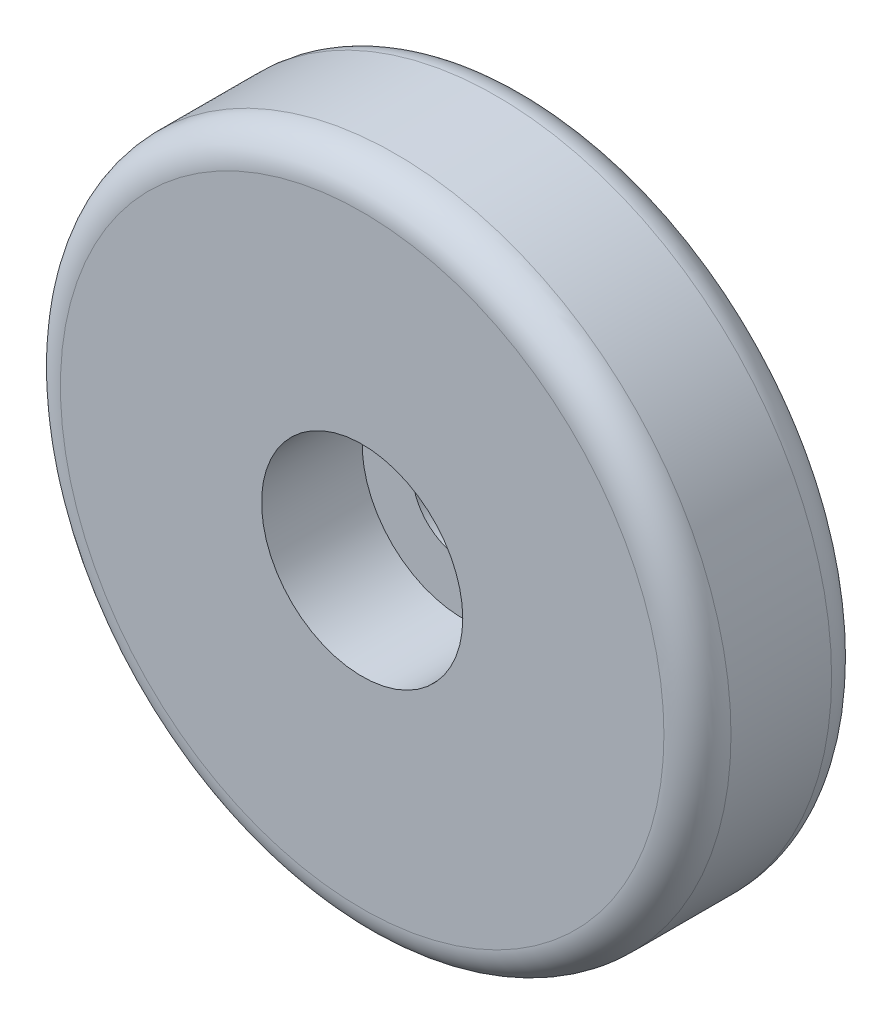
ISO-10303-21;
HEADER;
FILE_DESCRIPTION(('STEP AP214'),'2;1');
FILE_NAME('part.step','',(''),(''),'','','');
FILE_SCHEMA(('AUTOMOTIVE_DESIGN { 1 0 10303 214 1 1 1 1 }'));
ENDSEC;
DATA;
#1=APPLICATION_CONTEXT('core data for automotive mechanical design processes');
#2=APPLICATION_PROTOCOL_DEFINITION('international standard','automotive_design',2000,#1);
#3=PRODUCT_CONTEXT('',#1,'mechanical');
#4=PRODUCT('Part','Part','',(#3));
#5=PRODUCT_RELATED_PRODUCT_CATEGORY('part','',(#4));
#6=PRODUCT_DEFINITION_FORMATION('','',#4);
#7=PRODUCT_DEFINITION_CONTEXT('part definition',#1,'design');
#8=PRODUCT_DEFINITION('design','',#6,#7);
#9=PRODUCT_DEFINITION_SHAPE('','',#8);
#10=(LENGTH_UNIT() NAMED_UNIT(*) SI_UNIT(.MILLI.,.METRE.));
#11=(NAMED_UNIT(*) PLANE_ANGLE_UNIT() SI_UNIT($,.RADIAN.));
#12=(NAMED_UNIT(*) SI_UNIT($,.STERADIAN.) SOLID_ANGLE_UNIT());
#13=UNCERTAINTY_MEASURE_WITH_UNIT(LENGTH_MEASURE(1.E-05),#10,'distance_accuracy_value','');
#14=(GEOMETRIC_REPRESENTATION_CONTEXT(3) GLOBAL_UNCERTAINTY_ASSIGNED_CONTEXT((#13)) GLOBAL_UNIT_ASSIGNED_CONTEXT((#10,
#11,#12)) REPRESENTATION_CONTEXT('',''));
#15=CARTESIAN_POINT('',(0.,0.,0.));
#16=DIRECTION('',(0.,0.,1.));
#17=DIRECTION('',(1.,0.,0.));
#18=AXIS2_PLACEMENT_3D('',#15,#16,#17);
#19=CARTESIAN_POINT('',(0.,0.,5.));
#20=DIRECTION('',(0.,0.,1.));
#21=DIRECTION('',(1.,0.,0.));
#22=AXIS2_PLACEMENT_3D('',#19,#20,#21);
#23=PLANE('',#22);
#24=CARTESIAN_POINT('',(0.,0.,5.));
#25=DIRECTION('',(0.,0.,1.));
#26=DIRECTION('',(1.,0.,0.));
#27=AXIS2_PLACEMENT_3D('',#24,#25,#26);
#28=CIRCLE('',#27,3.);
#29=CARTESIAN_POINT('',(3.,0.,5.));
#30=VERTEX_POINT('',#29);
#31=EDGE_CURVE('E44',#30,#30,#28,.T.);
#32=ORIENTED_EDGE('',*,*,#31,.F.);
#33=EDGE_LOOP('',(#32));
#34=FACE_BOUND('',#33,.T.);
#35=CARTESIAN_POINT('',(0.,0.,5.));
#36=DIRECTION('',(0.,0.,1.));
#37=DIRECTION('',(1.,0.,0.));
#38=AXIS2_PLACEMENT_3D('',#35,#36,#37);
#39=CIRCLE('',#38,9.);
#40=CARTESIAN_POINT('',(9.,0.,5.));
#41=VERTEX_POINT('',#40);
#42=EDGE_CURVE('E60',#41,#41,#39,.T.);
#43=ORIENTED_EDGE('',*,*,#42,.T.);
#44=EDGE_LOOP('',(#43));
#45=FACE_BOUND('',#44,.T.);
#46=ADVANCED_FACE('F40',(#34,#45),#23,.T.);
#47=CARTESIAN_POINT('',(0.,0.,2.));
#48=DIRECTION('',(0.,0.,1.));
#49=DIRECTION('',(1.,0.,0.));
#50=AXIS2_PLACEMENT_3D('',#47,#48,#49);
#51=CYLINDRICAL_SURFACE('',#50,3.);
#52=CARTESIAN_POINT('',(0.,0.,2.));
#53=DIRECTION('',(0.,0.,1.));
#54=DIRECTION('',(1.,0.,0.));
#55=AXIS2_PLACEMENT_3D('',#52,#53,#54);
#56=CIRCLE('',#55,3.);
#57=CARTESIAN_POINT('',(3.,0.,2.));
#58=VERTEX_POINT('',#57);
#59=EDGE_CURVE('E11',#58,#58,#56,.T.);
#60=ORIENTED_EDGE('',*,*,#59,.F.);
#61=EDGE_LOOP('',(#60));
#62=FACE_BOUND('',#61,.T.);
#63=ORIENTED_EDGE('',*,*,#31,.T.);
#64=EDGE_LOOP('',(#63));
#65=FACE_BOUND('',#64,.T.);
#66=ADVANCED_FACE('F99',(#62,#65),#51,.F.);
#67=CARTESIAN_POINT('',(0.,0.,2.));
#68=DIRECTION('',(0.,0.,1.));
#69=DIRECTION('',(1.,0.,0.));
#70=AXIS2_PLACEMENT_3D('',#67,#68,#69);
#71=PLANE('',#70);
#72=CARTESIAN_POINT('',(0.,0.,2.));
#73=DIRECTION('',(0.,0.,1.));
#74=DIRECTION('',(1.,0.,0.));
#75=AXIS2_PLACEMENT_3D('',#72,#73,#74);
#76=CIRCLE('',#75,1.5);
#77=CARTESIAN_POINT('',(1.5,0.,2.));
#78=VERTEX_POINT('',#77);
#79=EDGE_CURVE('E64',#78,#78,#76,.T.);
#80=ORIENTED_EDGE('',*,*,#79,.F.);
#81=EDGE_LOOP('',(#80));
#82=FACE_BOUND('',#81,.T.);
#83=ORIENTED_EDGE('',*,*,#59,.T.);
#84=EDGE_LOOP('',(#83));
#85=FACE_BOUND('',#84,.T.);
#86=ADVANCED_FACE('F105',(#82,#85),#71,.T.);
#87=CARTESIAN_POINT('',(0.,0.,4.));
#88=DIRECTION('',(0.,0.,1.));
#89=DIRECTION('',(1.,0.,0.));
#90=AXIS2_PLACEMENT_3D('',#87,#88,#89);
#91=TOROIDAL_SURFACE('',#90,9.,1.);
#92=CARTESIAN_POINT('',(0.,0.,4.));
#93=DIRECTION('',(0.,0.,1.));
#94=DIRECTION('',(1.,0.,0.));
#95=AXIS2_PLACEMENT_3D('',#92,#93,#94);
#96=CIRCLE('',#95,10.);
#97=CARTESIAN_POINT('',(10.,0.,4.));
#98=VERTEX_POINT('',#97);
#99=EDGE_CURVE('E55',#98,#98,#96,.T.);
#100=ORIENTED_EDGE('',*,*,#99,.T.);
#101=EDGE_LOOP('',(#100));
#102=FACE_BOUND('',#101,.T.);
#103=ORIENTED_EDGE('',*,*,#42,.F.);
#104=EDGE_LOOP('',(#103));
#105=FACE_BOUND('',#104,.T.);
#106=ADVANCED_FACE('F93',(#102,#105),#91,.T.);
#107=CARTESIAN_POINT('',(0.,0.,5.));
#108=DIRECTION('',(0.,0.,-1.));
#109=DIRECTION('',(-1.,0.,0.));
#110=AXIS2_PLACEMENT_3D('',#107,#108,#109);
#111=CYLINDRICAL_SURFACE('',#110,10.);
#112=ORIENTED_EDGE('',*,*,#99,.F.);
#113=EDGE_LOOP('',(#112));
#114=FACE_BOUND('',#113,.T.);
#115=CARTESIAN_POINT('',(0.,0.,1.));
#116=DIRECTION('',(0.,0.,1.));
#117=DIRECTION('',(1.,0.,0.));
#118=AXIS2_PLACEMENT_3D('',#115,#116,#117);
#119=CIRCLE('',#118,10.);
#120=CARTESIAN_POINT('',(10.,0.,1.));
#121=VERTEX_POINT('',#120);
#122=EDGE_CURVE('E59',#121,#121,#119,.T.);
#123=ORIENTED_EDGE('',*,*,#122,.T.);
#124=EDGE_LOOP('',(#123));
#125=FACE_BOUND('',#124,.T.);
#126=ADVANCED_FACE('F42',(#114,#125),#111,.T.);
#127=CARTESIAN_POINT('',(0.,0.,1.));
#128=DIRECTION('',(0.,0.,1.));
#129=DIRECTION('',(1.,0.,0.));
#130=AXIS2_PLACEMENT_3D('',#127,#128,#129);
#131=TOROIDAL_SURFACE('',#130,9.,1.);
#132=ORIENTED_EDGE('',*,*,#122,.F.);
#133=EDGE_LOOP('',(#132));
#134=FACE_BOUND('',#133,.T.);
#135=CARTESIAN_POINT('',(0.,0.,0.));
#136=DIRECTION('',(0.,0.,1.));
#137=DIRECTION('',(1.,0.,0.));
#138=AXIS2_PLACEMENT_3D('',#135,#136,#137);
#139=CIRCLE('',#138,9.);
#140=CARTESIAN_POINT('',(9.,0.,0.));
#141=VERTEX_POINT('',#140);
#142=EDGE_CURVE('E53',#141,#141,#139,.T.);
#143=ORIENTED_EDGE('',*,*,#142,.T.);
#144=EDGE_LOOP('',(#143));
#145=FACE_BOUND('',#144,.T.);
#146=ADVANCED_FACE('F84',(#134,#145),#131,.T.);
#147=CARTESIAN_POINT('',(0.,0.,0.));
#148=DIRECTION('',(0.,0.,1.));
#149=DIRECTION('',(1.,0.,0.));
#150=AXIS2_PLACEMENT_3D('',#147,#148,#149);
#151=PLANE('',#150);
#152=CARTESIAN_POINT('',(0.,0.,0.));
#153=DIRECTION('',(0.,0.,-1.));
#154=DIRECTION('',(-1.,0.,0.));
#155=AXIS2_PLACEMENT_3D('',#152,#153,#154);
#156=CIRCLE('',#155,1.5);
#157=CARTESIAN_POINT('',(-1.5,0.,0.));
#158=VERTEX_POINT('',#157);
#159=EDGE_CURVE('E74',#158,#158,#156,.T.);
#160=ORIENTED_EDGE('',*,*,#159,.F.);
#161=EDGE_LOOP('',(#160));
#162=FACE_BOUND('',#161,.T.);
#163=ORIENTED_EDGE('',*,*,#142,.F.);
#164=EDGE_LOOP('',(#163));
#165=FACE_BOUND('',#164,.T.);
#166=ADVANCED_FACE('F81',(#162,#165),#151,.F.);
#167=CARTESIAN_POINT('',(0.,0.,3.));
#168=DIRECTION('',(0.,0.,-1.));
#169=DIRECTION('',(-1.,0.,0.));
#170=AXIS2_PLACEMENT_3D('',#167,#168,#169);
#171=CYLINDRICAL_SURFACE('',#170,1.5);
#172=ORIENTED_EDGE('',*,*,#79,.T.);
#173=EDGE_LOOP('',(#172));
#174=FACE_BOUND('',#173,.T.);
#175=ORIENTED_EDGE('',*,*,#159,.T.);
#176=EDGE_LOOP('',(#175));
#177=FACE_BOUND('',#176,.T.);
#178=ADVANCED_FACE('F79',(#174,#177),#171,.F.);
#179=CLOSED_SHELL('',(#46,#66,#86,#106,#126,#146,#166,#178));
#180=MANIFOLD_SOLID_BREP('B2',#179);
#181=ADVANCED_BREP_SHAPE_REPRESENTATION('',(#18,#180),#14);
#182=SHAPE_DEFINITION_REPRESENTATION(#9,#181);
ENDSEC;
END-ISO-10303-21;
